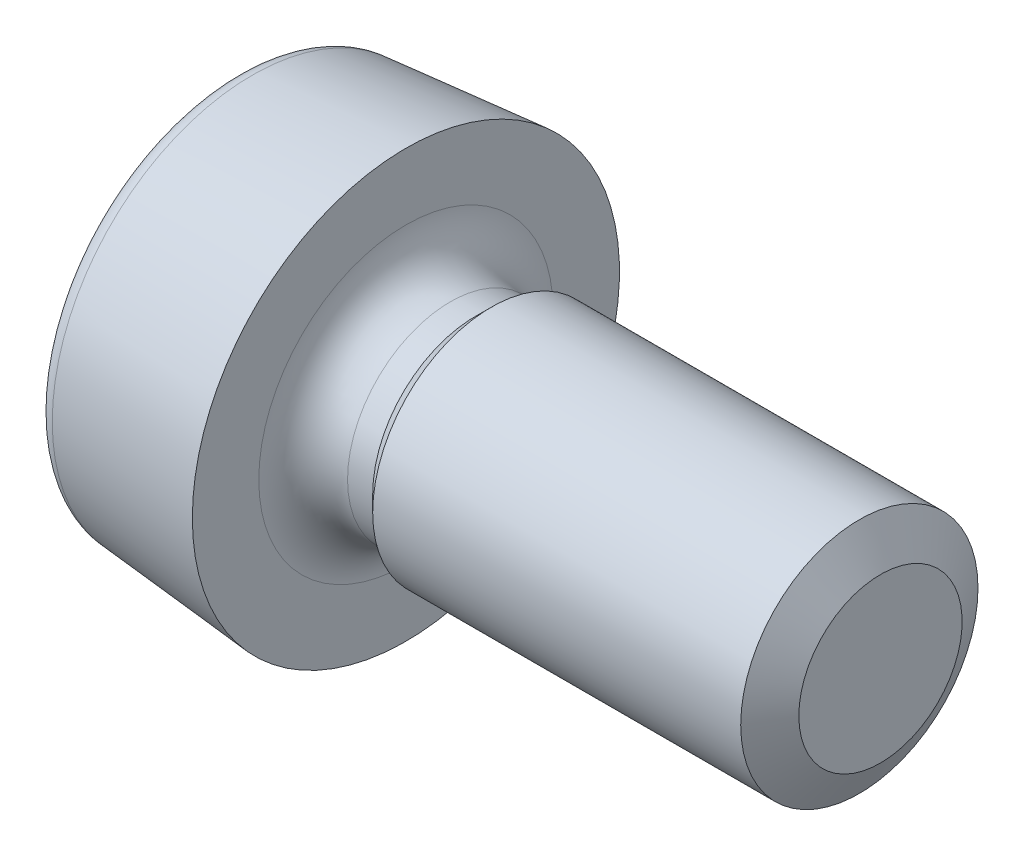
ISO-10303-21;
HEADER;
FILE_DESCRIPTION(('STEP AP214'),'2;1');
FILE_NAME('part.step','',(''),(''),'','','');
FILE_SCHEMA(('AUTOMOTIVE_DESIGN { 1 0 10303 214 1 1 1 1 }'));
ENDSEC;
DATA;
#1=APPLICATION_CONTEXT('core data for automotive mechanical design processes');
#2=APPLICATION_PROTOCOL_DEFINITION('international standard','automotive_design',2000,#1);
#3=PRODUCT_CONTEXT('',#1,'mechanical');
#4=PRODUCT('Part','Part','',(#3));
#5=PRODUCT_RELATED_PRODUCT_CATEGORY('part','',(#4));
#6=PRODUCT_DEFINITION_FORMATION('','',#4);
#7=PRODUCT_DEFINITION_CONTEXT('part definition',#1,'design');
#8=PRODUCT_DEFINITION('design','',#6,#7);
#9=PRODUCT_DEFINITION_SHAPE('','',#8);
#10=(LENGTH_UNIT() NAMED_UNIT(*) SI_UNIT(.MILLI.,.METRE.));
#11=(NAMED_UNIT(*) PLANE_ANGLE_UNIT() SI_UNIT($,.RADIAN.));
#12=(NAMED_UNIT(*) SI_UNIT($,.STERADIAN.) SOLID_ANGLE_UNIT());
#13=UNCERTAINTY_MEASURE_WITH_UNIT(LENGTH_MEASURE(1.E-05),#10,'distance_accuracy_value','');
#14=(GEOMETRIC_REPRESENTATION_CONTEXT(3) GLOBAL_UNCERTAINTY_ASSIGNED_CONTEXT((#13)) GLOBAL_UNIT_ASSIGNED_CONTEXT((#10,
#11,#12)) REPRESENTATION_CONTEXT('',''));
#15=CARTESIAN_POINT('',(0.,0.,0.));
#16=DIRECTION('',(0.,0.,1.));
#17=DIRECTION('',(1.,0.,0.));
#18=AXIS2_PLACEMENT_3D('',#15,#16,#17);
#19=CARTESIAN_POINT('',(0.,1.90925417084986,0.));
#20=DIRECTION('',(1.,0.,0.));
#21=DIRECTION('',(0.,0.,-1.));
#22=AXIS2_PLACEMENT_3D('',#19,#20,#21);
#23=PLANE('',#22);
#24=CARTESIAN_POINT('',(0.,0.,0.));
#25=DIRECTION('',(-1.,0.,0.));
#26=DIRECTION('',(0.,0.,1.));
#27=AXIS2_PLACEMENT_3D('',#24,#25,#26);
#28=CIRCLE('',#27,1.90925417084986);
#29=CARTESIAN_POINT('',(0.,0.,1.90925417084986));
#30=VERTEX_POINT('',#29);
#31=EDGE_CURVE('E171',#30,#30,#28,.T.);
#32=ORIENTED_EDGE('',*,*,#31,.T.);
#33=EDGE_LOOP('',(#32));
#34=FACE_BOUND('',#33,.T.);
#35=DIRECTION('',(0.,0.,1.));
#36=VECTOR('',#35,1.);
#37=CARTESIAN_POINT('',(0.,-0.225000000000005,1.35));
#38=LINE('',#37,#36);
#39=CARTESIAN_POINT('',(0.,-0.225000000000001,0.225));
#40=VERTEX_POINT('',#39);
#41=CARTESIAN_POINT('',(0.,-0.225000000000005,1.35));
#42=VERTEX_POINT('',#41);
#43=EDGE_CURVE('E137',#40,#42,#38,.T.);
#44=ORIENTED_EDGE('',*,*,#43,.F.);
#45=DIRECTION('',(0.,1.,0.));
#46=VECTOR('',#45,1.);
#47=CARTESIAN_POINT('',(0.,1.35,0.225));
#48=LINE('',#47,#46);
#49=CARTESIAN_POINT('',(0.,-1.35,0.225));
#50=VERTEX_POINT('',#49);
#51=EDGE_CURVE('E156',#50,#40,#48,.T.);
#52=ORIENTED_EDGE('',*,*,#51,.F.);
#53=DIRECTION('',(0.,0.,1.));
#54=VECTOR('',#53,1.);
#55=CARTESIAN_POINT('',(0.,-1.35,-0.225));
#56=LINE('',#55,#54);
#57=CARTESIAN_POINT('',(0.,-1.35,-0.225));
#58=VERTEX_POINT('',#57);
#59=EDGE_CURVE('E148',#58,#50,#56,.T.);
#60=ORIENTED_EDGE('',*,*,#59,.F.);
#61=DIRECTION('',(0.,-1.,0.));
#62=VECTOR('',#61,1.);
#63=CARTESIAN_POINT('',(0.,1.35,-0.225));
#64=LINE('',#63,#62);
#65=CARTESIAN_POINT('',(0.,-0.224999999999999,-0.225));
#66=VERTEX_POINT('',#65);
#67=EDGE_CURVE('E80',#66,#58,#64,.T.);
#68=ORIENTED_EDGE('',*,*,#67,.F.);
#69=CARTESIAN_POINT('',(0.,-0.224999999999995,-1.35));
#70=VERTEX_POINT('',#69);
#71=EDGE_CURVE('E95',#70,#66,#38,.T.);
#72=ORIENTED_EDGE('',*,*,#71,.F.);
#73=DIRECTION('',(0.,-1.,0.));
#74=VECTOR('',#73,1.);
#75=CARTESIAN_POINT('',(0.,0.225000000000005,-1.35));
#76=LINE('',#75,#74);
#77=CARTESIAN_POINT('',(0.,0.225000000000005,-1.35));
#78=VERTEX_POINT('',#77);
#79=EDGE_CURVE('E133',#78,#70,#76,.T.);
#80=ORIENTED_EDGE('',*,*,#79,.F.);
#81=DIRECTION('',(0.,0.,-1.));
#82=VECTOR('',#81,1.);
#83=CARTESIAN_POINT('',(0.,0.224999999999995,1.35));
#84=LINE('',#83,#82);
#85=CARTESIAN_POINT('',(0.,0.225000000000001,-0.225));
#86=VERTEX_POINT('',#85);
#87=EDGE_CURVE('E134',#86,#78,#84,.T.);
#88=ORIENTED_EDGE('',*,*,#87,.F.);
#89=CARTESIAN_POINT('',(0.,1.35,-0.225));
#90=VERTEX_POINT('',#89);
#91=EDGE_CURVE('E151',#90,#86,#64,.T.);
#92=ORIENTED_EDGE('',*,*,#91,.F.);
#93=DIRECTION('',(0.,0.,-1.));
#94=VECTOR('',#93,1.);
#95=CARTESIAN_POINT('',(0.,1.35,-0.225));
#96=LINE('',#95,#94);
#97=CARTESIAN_POINT('',(0.,1.35,0.225));
#98=VERTEX_POINT('',#97);
#99=EDGE_CURVE('E153',#98,#90,#96,.T.);
#100=ORIENTED_EDGE('',*,*,#99,.F.);
#101=CARTESIAN_POINT('',(0.,0.224999999999999,0.225));
#102=VERTEX_POINT('',#101);
#103=EDGE_CURVE('E65',#102,#98,#48,.T.);
#104=ORIENTED_EDGE('',*,*,#103,.F.);
#105=CARTESIAN_POINT('',(0.,0.224999999999995,1.35));
#106=VERTEX_POINT('',#105);
#107=EDGE_CURVE('E127',#106,#102,#84,.T.);
#108=ORIENTED_EDGE('',*,*,#107,.F.);
#109=DIRECTION('',(0.,1.,0.));
#110=VECTOR('',#109,1.);
#111=CARTESIAN_POINT('',(0.,0.224999999999995,1.35));
#112=LINE('',#111,#110);
#113=EDGE_CURVE('E115',#42,#106,#112,.T.);
#114=ORIENTED_EDGE('',*,*,#113,.F.);
#115=EDGE_LOOP('',(#44,#52,#60,#68,#72,#80,#88,#92,#100,#104,#108,#114));
#116=FACE_BOUND('',#115,.T.);
#117=ADVANCED_FACE('F42',(#34,#116),#23,.F.);
#118=CARTESIAN_POINT('',(1.2,0.,0.));
#119=DIRECTION('',(-0.184288535050185,0.,-0.982872186934322));
#120=DIRECTION('',(-0.982872186934322,0.,0.184288535050185));
#121=AXIS2_PLACEMENT_3D('',#118,#119,#120);
#122=PLANE('',#121);
#123=ORIENTED_EDGE('',*,*,#51,.T.);
#124=DIRECTION('',(0.966595349328283,0.181236627999054,-0.181236627999053));
#125=VECTOR('',#124,1.);
#126=CARTESIAN_POINT('',(1.2,0.,0.));
#127=LINE('',#126,#125);
#128=CARTESIAN_POINT('',(1.2,0.,0.));
#129=VERTEX_POINT('',#128);
#130=EDGE_CURVE('E87',#40,#129,#127,.T.);
#131=ORIENTED_EDGE('',*,*,#130,.T.);
#132=DIRECTION('',(0.659268514744263,0.741677079087296,-0.123612846514549));
#133=VECTOR('',#132,1.);
#134=CARTESIAN_POINT('',(0.,-1.35,0.225));
#135=LINE('',#134,#133);
#136=EDGE_CURVE('E161',#50,#129,#135,.T.);
#137=ORIENTED_EDGE('',*,*,#136,.F.);
#138=EDGE_LOOP('',(#123,#131,#137));
#139=FACE_BOUND('',#138,.T.);
#140=ADVANCED_FACE('F205',(#139),#122,.T.);
#141=DIRECTION('',(0.659268514744263,-0.741677079087296,-0.123612846514549));
#142=VECTOR('',#141,1.);
#143=CARTESIAN_POINT('',(0.,1.35,0.225));
#144=LINE('',#143,#142);
#145=EDGE_CURVE('E159',#98,#129,#144,.T.);
#146=ORIENTED_EDGE('',*,*,#145,.T.);
#147=DIRECTION('',(-0.966595349328283,0.181236627999053,0.181236627999053));
#148=VECTOR('',#147,1.);
#149=CARTESIAN_POINT('',(1.2,0.,0.));
#150=LINE('',#149,#148);
#151=EDGE_CURVE('E123',#129,#102,#150,.T.);
#152=ORIENTED_EDGE('',*,*,#151,.T.);
#153=ORIENTED_EDGE('',*,*,#103,.T.);
#154=EDGE_LOOP('',(#146,#152,#153));
#155=FACE_BOUND('',#154,.T.);
#156=ADVANCED_FACE('F198',(#155),#122,.T.);
#157=CARTESIAN_POINT('',(1.2,0.,0.));
#158=DIRECTION('',(-0.184288535050185,0.,0.982872186934322));
#159=DIRECTION('',(0.982872186934322,0.,0.184288535050185));
#160=AXIS2_PLACEMENT_3D('',#157,#158,#159);
#161=PLANE('',#160);
#162=DIRECTION('',(0.659268514744263,0.741677079087296,0.123612846514549));
#163=VECTOR('',#162,1.);
#164=CARTESIAN_POINT('',(0.,-1.35,-0.225));
#165=LINE('',#164,#163);
#166=EDGE_CURVE('E147',#58,#129,#165,.T.);
#167=ORIENTED_EDGE('',*,*,#166,.T.);
#168=DIRECTION('',(-0.966595349328283,-0.181236627999053,-0.181236627999053));
#169=VECTOR('',#168,1.);
#170=CARTESIAN_POINT('',(1.2,0.,0.));
#171=LINE('',#170,#169);
#172=EDGE_CURVE('E11',#129,#66,#171,.T.);
#173=ORIENTED_EDGE('',*,*,#172,.T.);
#174=ORIENTED_EDGE('',*,*,#67,.T.);
#175=EDGE_LOOP('',(#167,#173,#174));
#176=FACE_BOUND('',#175,.T.);
#177=ADVANCED_FACE('F199',(#176),#161,.T.);
#178=ORIENTED_EDGE('',*,*,#91,.T.);
#179=DIRECTION('',(0.966595349328283,-0.181236627999054,0.181236627999053));
#180=VECTOR('',#179,1.);
#181=CARTESIAN_POINT('',(1.2,0.,0.));
#182=LINE('',#181,#180);
#183=EDGE_CURVE('E49',#86,#129,#182,.T.);
#184=ORIENTED_EDGE('',*,*,#183,.T.);
#185=DIRECTION('',(0.659268514744263,-0.741677079087296,0.123612846514549));
#186=VECTOR('',#185,1.);
#187=CARTESIAN_POINT('',(0.,1.35,-0.225));
#188=LINE('',#187,#186);
#189=EDGE_CURVE('E56',#90,#129,#188,.T.);
#190=ORIENTED_EDGE('',*,*,#189,.F.);
#191=EDGE_LOOP('',(#178,#184,#190));
#192=FACE_BOUND('',#191,.T.);
#193=ADVANCED_FACE('F192',(#192),#161,.T.);
#194=CARTESIAN_POINT('',(-2.16958058991907,0.,0.));
#195=DIRECTION('',(-1.,0.,0.));
#196=DIRECTION('',(0.,0.,1.));
#197=AXIS2_PLACEMENT_3D('',#194,#195,#196);
#198=CYLINDRICAL_SURFACE('',#197,1.25);
#199=CARTESIAN_POINT('',(2.7,0.,0.));
#200=DIRECTION('',(-1.,0.,0.));
#201=DIRECTION('',(0.,0.,1.));
#202=AXIS2_PLACEMENT_3D('',#199,#200,#201);
#203=CIRCLE('',#202,1.25);
#204=CARTESIAN_POINT('',(2.7,0.,1.25));
#205=VERTEX_POINT('',#204);
#206=EDGE_CURVE('E190',#205,#205,#203,.T.);
#207=ORIENTED_EDGE('',*,*,#206,.F.);
#208=EDGE_LOOP('',(#207));
#209=FACE_BOUND('',#208,.T.);
#210=CARTESIAN_POINT('',(6.57743720258487,0.,0.));
#211=DIRECTION('',(-1.,0.,0.));
#212=DIRECTION('',(0.,0.,1.));
#213=AXIS2_PLACEMENT_3D('',#210,#211,#212);
#214=CIRCLE('',#213,1.25);
#215=CARTESIAN_POINT('',(6.57743720258487,0.,1.25));
#216=VERTEX_POINT('',#215);
#217=EDGE_CURVE('E168',#216,#216,#214,.T.);
#218=ORIENTED_EDGE('',*,*,#217,.T.);
#219=EDGE_LOOP('',(#218));
#220=FACE_BOUND('',#219,.T.);
#221=ADVANCED_FACE('F263',(#209,#220),#198,.T.);
#222=CARTESIAN_POINT('',(2.7,0.,0.));
#223=DIRECTION('',(1.,0.,0.));
#224=DIRECTION('',(0.,0.,-1.));
#225=AXIS2_PLACEMENT_3D('',#222,#223,#224);
#226=CONICAL_SURFACE('',#225,1.25,0.785398163397442);
#227=CARTESIAN_POINT('',(2.5325,0.,0.));
#228=DIRECTION('',(-1.,0.,0.));
#229=DIRECTION('',(0.,0.,1.));
#230=AXIS2_PLACEMENT_3D('',#227,#228,#229);
#231=CIRCLE('',#230,1.0825);
#232=CARTESIAN_POINT('',(2.5325,0.,1.0825));
#233=VERTEX_POINT('',#232);
#234=EDGE_CURVE('E187',#233,#233,#231,.T.);
#235=ORIENTED_EDGE('',*,*,#234,.F.);
#236=EDGE_LOOP('',(#235));
#237=FACE_BOUND('',#236,.T.);
#238=ORIENTED_EDGE('',*,*,#206,.T.);
#239=EDGE_LOOP('',(#238));
#240=FACE_BOUND('',#239,.T.);
#241=ADVANCED_FACE('F257',(#237,#240),#226,.T.);
#242=CARTESIAN_POINT('',(-2.16958058991907,0.,0.));
#243=DIRECTION('',(-1.,0.,0.));
#244=DIRECTION('',(0.,0.,1.));
#245=AXIS2_PLACEMENT_3D('',#242,#243,#244);
#246=CYLINDRICAL_SURFACE('',#245,1.0825);
#247=CARTESIAN_POINT('',(2.2675,0.,0.));
#248=DIRECTION('',(-1.,0.,0.));
#249=DIRECTION('',(0.,0.,1.));
#250=AXIS2_PLACEMENT_3D('',#247,#248,#249);
#251=CIRCLE('',#250,1.0825);
#252=CARTESIAN_POINT('',(2.2675,0.,1.0825));
#253=VERTEX_POINT('',#252);
#254=EDGE_CURVE('E184',#253,#253,#251,.T.);
#255=ORIENTED_EDGE('',*,*,#254,.F.);
#256=EDGE_LOOP('',(#255));
#257=FACE_BOUND('',#256,.T.);
#258=ORIENTED_EDGE('',*,*,#234,.T.);
#259=EDGE_LOOP('',(#258));
#260=FACE_BOUND('',#259,.T.);
#261=ADVANCED_FACE('F251',(#257,#260),#246,.T.);
#262=CARTESIAN_POINT('',(2.2675,0.,0.));
#263=DIRECTION('',(-1.,0.,0.));
#264=DIRECTION('',(0.,0.,1.));
#265=AXIS2_PLACEMENT_3D('',#262,#263,#264);
#266=TOROIDAL_SURFACE('',#265,1.55,0.4675);
#267=CARTESIAN_POINT('',(1.8,0.,0.));
#268=DIRECTION('',(-1.,0.,0.));
#269=DIRECTION('',(0.,0.,1.));
#270=AXIS2_PLACEMENT_3D('',#267,#268,#269);
#271=CIRCLE('',#270,1.55);
#272=CARTESIAN_POINT('',(1.8,0.,1.55));
#273=VERTEX_POINT('',#272);
#274=EDGE_CURVE('E181',#273,#273,#271,.T.);
#275=ORIENTED_EDGE('',*,*,#274,.F.);
#276=EDGE_LOOP('',(#275));
#277=FACE_BOUND('',#276,.T.);
#278=ORIENTED_EDGE('',*,*,#254,.T.);
#279=EDGE_LOOP('',(#278));
#280=FACE_BOUND('',#279,.T.);
#281=ADVANCED_FACE('F245',(#277,#280),#266,.F.);
#282=CARTESIAN_POINT('',(1.8,1.55,0.));
#283=DIRECTION('',(-1.,0.,0.));
#284=DIRECTION('',(0.,0.,1.));
#285=AXIS2_PLACEMENT_3D('',#282,#283,#284);
#286=PLANE('',#285);
#287=CARTESIAN_POINT('',(1.8,0.,0.));
#288=DIRECTION('',(-1.,0.,0.));
#289=DIRECTION('',(0.,0.,1.));
#290=AXIS2_PLACEMENT_3D('',#287,#288,#289);
#291=CIRCLE('',#290,2.25);
#292=CARTESIAN_POINT('',(1.8,0.,2.25));
#293=VERTEX_POINT('',#292);
#294=EDGE_CURVE('E177',#293,#293,#291,.T.);
#295=ORIENTED_EDGE('',*,*,#294,.F.);
#296=EDGE_LOOP('',(#295));
#297=FACE_BOUND('',#296,.T.);
#298=ORIENTED_EDGE('',*,*,#274,.T.);
#299=EDGE_LOOP('',(#298));
#300=FACE_BOUND('',#299,.T.);
#301=ADVANCED_FACE('F239',(#297,#300),#286,.F.);
#302=CARTESIAN_POINT('',(1.8,0.,0.));
#303=DIRECTION('',(1.,0.,0.));
#304=DIRECTION('',(0.,0.,-1.));
#305=AXIS2_PLACEMENT_3D('',#302,#303,#304);
#306=CONICAL_SURFACE('',#305,2.25,0.0872664625997097);
#307=CARTESIAN_POINT('',(0.18256885145047,0.,0.));
#308=DIRECTION('',(-1.,0.,0.));
#309=DIRECTION('',(0.,0.,1.));
#310=AXIS2_PLACEMENT_3D('',#307,#308,#309);
#311=CIRCLE('',#310,2.10849311046821);
#312=CARTESIAN_POINT('',(0.18256885145047,0.,2.10849311046821));
#313=VERTEX_POINT('',#312);
#314=EDGE_CURVE('E174',#313,#313,#311,.T.);
#315=ORIENTED_EDGE('',*,*,#314,.F.);
#316=EDGE_LOOP('',(#315));
#317=FACE_BOUND('',#316,.T.);
#318=ORIENTED_EDGE('',*,*,#294,.T.);
#319=EDGE_LOOP('',(#318));
#320=FACE_BOUND('',#319,.T.);
#321=ADVANCED_FACE('F233',(#317,#320),#306,.T.);
#322=CARTESIAN_POINT('',(0.2,0.,0.));
#323=DIRECTION('',(-1.,0.,0.));
#324=DIRECTION('',(0.,0.,1.));
#325=AXIS2_PLACEMENT_3D('',#322,#323,#324);
#326=TOROIDAL_SURFACE('',#325,1.90925417084986,0.2);
#327=ORIENTED_EDGE('',*,*,#31,.F.);
#328=EDGE_LOOP('',(#327));
#329=FACE_BOUND('',#328,.T.);
#330=ORIENTED_EDGE('',*,*,#314,.T.);
#331=EDGE_LOOP('',(#330));
#332=FACE_BOUND('',#331,.T.);
#333=ADVANCED_FACE('F229',(#329,#332),#326,.T.);
#334=CARTESIAN_POINT('',(6.57743720258487,0.,0.));
#335=DIRECTION('',(-1.,0.,0.));
#336=DIRECTION('',(0.,0.,1.));
#337=AXIS2_PLACEMENT_3D('',#334,#335,#336);
#338=CONICAL_SURFACE('',#337,1.25,1.05188801855281);
#339=CARTESIAN_POINT('',(6.8,0.,0.));
#340=DIRECTION('',(-1.,0.,0.));
#341=DIRECTION('',(0.,0.,1.));
#342=AXIS2_PLACEMENT_3D('',#339,#340,#341);
#343=CIRCLE('',#342,0.860299999999999);
#344=CARTESIAN_POINT('',(6.8,0.,0.860299999999999));
#345=VERTEX_POINT('',#344);
#346=EDGE_CURVE('E155',#345,#345,#343,.T.);
#347=ORIENTED_EDGE('',*,*,#346,.T.);
#348=EDGE_LOOP('',(#347));
#349=FACE_BOUND('',#348,.T.);
#350=ORIENTED_EDGE('',*,*,#217,.F.);
#351=EDGE_LOOP('',(#350));
#352=FACE_BOUND('',#351,.T.);
#353=ADVANCED_FACE('F232',(#349,#352),#338,.T.);
#354=CARTESIAN_POINT('',(6.8,0.,0.));
#355=DIRECTION('',(-1.,0.,0.));
#356=DIRECTION('',(0.,0.,1.));
#357=AXIS2_PLACEMENT_3D('',#354,#355,#356);
#358=PLANE('',#357);
#359=ORIENTED_EDGE('',*,*,#346,.F.);
#360=EDGE_LOOP('',(#359));
#361=FACE_BOUND('',#360,.T.);
#362=ADVANCED_FACE('F273',(#361),#358,.F.);
#363=CARTESIAN_POINT('',(0.,1.35,0.225));
#364=DIRECTION('',(0.74740931868366,0.66436383882992,0.));
#365=DIRECTION('',(-0.66436383882992,0.74740931868366,0.));
#366=AXIS2_PLACEMENT_3D('',#363,#364,#365);
#367=PLANE('',#366);
#368=ORIENTED_EDGE('',*,*,#145,.F.);
#369=ORIENTED_EDGE('',*,*,#99,.T.);
#370=ORIENTED_EDGE('',*,*,#189,.T.);
#371=EDGE_LOOP('',(#368,#369,#370));
#372=FACE_BOUND('',#371,.T.);
#373=ADVANCED_FACE('F197',(#372),#367,.F.);
#374=CARTESIAN_POINT('',(0.,-1.35,-0.225));
#375=DIRECTION('',(0.74740931868366,-0.66436383882992,0.));
#376=DIRECTION('',(0.66436383882992,0.74740931868366,0.));
#377=AXIS2_PLACEMENT_3D('',#374,#375,#376);
#378=PLANE('',#377);
#379=ORIENTED_EDGE('',*,*,#166,.F.);
#380=ORIENTED_EDGE('',*,*,#59,.T.);
#381=ORIENTED_EDGE('',*,*,#136,.T.);
#382=EDGE_LOOP('',(#379,#380,#381));
#383=FACE_BOUND('',#382,.T.);
#384=ADVANCED_FACE('F202',(#383),#378,.F.);
#385=CARTESIAN_POINT('',(1.2,0.,0.));
#386=DIRECTION('',(-0.184288535050185,0.982872186934322,0.));
#387=DIRECTION('',(-0.982872186934322,-0.184288535050185,0.));
#388=AXIS2_PLACEMENT_3D('',#385,#386,#387);
#389=PLANE('',#388);
#390=DIRECTION('',(0.659268514744263,0.123612846514547,0.741677079087297));
#391=VECTOR('',#390,1.);
#392=CARTESIAN_POINT('',(0.,-0.224999999999995,-1.35));
#393=LINE('',#392,#391);
#394=EDGE_CURVE('E129',#70,#129,#393,.T.);
#395=ORIENTED_EDGE('',*,*,#394,.F.);
#396=ORIENTED_EDGE('',*,*,#71,.T.);
#397=ORIENTED_EDGE('',*,*,#172,.F.);
#398=EDGE_LOOP('',(#395,#396,#397));
#399=FACE_BOUND('',#398,.T.);
#400=ADVANCED_FACE('F210',(#399),#389,.T.);
#401=CARTESIAN_POINT('',(1.2,0.,0.));
#402=DIRECTION('',(-0.184288535050185,-0.982872186934322,0.));
#403=DIRECTION('',(0.982872186934322,-0.184288535050185,0.));
#404=AXIS2_PLACEMENT_3D('',#401,#402,#403);
#405=PLANE('',#404);
#406=ORIENTED_EDGE('',*,*,#87,.T.);
#407=DIRECTION('',(0.659268514744263,-0.123612846514552,0.741677079087296));
#408=VECTOR('',#407,1.);
#409=CARTESIAN_POINT('',(0.,0.225000000000005,-1.35));
#410=LINE('',#409,#408);
#411=EDGE_CURVE('E130',#78,#129,#410,.T.);
#412=ORIENTED_EDGE('',*,*,#411,.T.);
#413=ORIENTED_EDGE('',*,*,#183,.F.);
#414=EDGE_LOOP('',(#406,#412,#413));
#415=FACE_BOUND('',#414,.T.);
#416=ADVANCED_FACE('F216',(#415),#405,.T.);
#417=CARTESIAN_POINT('',(0.,0.225000000000005,-1.35));
#418=DIRECTION('',(0.74740931868366,0.,-0.66436383882992));
#419=DIRECTION('',(0.66436383882992,0.,0.74740931868366));
#420=AXIS2_PLACEMENT_3D('',#417,#418,#419);
#421=PLANE('',#420);
#422=ORIENTED_EDGE('',*,*,#411,.F.);
#423=ORIENTED_EDGE('',*,*,#79,.T.);
#424=ORIENTED_EDGE('',*,*,#394,.T.);
#425=EDGE_LOOP('',(#422,#423,#424));
#426=FACE_BOUND('',#425,.T.);
#427=ADVANCED_FACE('F208',(#426),#421,.F.);
#428=ORIENTED_EDGE('',*,*,#43,.T.);
#429=DIRECTION('',(0.659268514744263,0.123612846514552,-0.741677079087296));
#430=VECTOR('',#429,1.);
#431=CARTESIAN_POINT('',(0.,-0.225000000000005,1.35));
#432=LINE('',#431,#430);
#433=EDGE_CURVE('E120',#42,#129,#432,.T.);
#434=ORIENTED_EDGE('',*,*,#433,.T.);
#435=ORIENTED_EDGE('',*,*,#130,.F.);
#436=EDGE_LOOP('',(#428,#434,#435));
#437=FACE_BOUND('',#436,.T.);
#438=ADVANCED_FACE('F206',(#437),#389,.T.);
#439=DIRECTION('',(0.659268514744263,-0.123612846514547,-0.741677079087297));
#440=VECTOR('',#439,1.);
#441=CARTESIAN_POINT('',(0.,0.224999999999995,1.35));
#442=LINE('',#441,#440);
#443=EDGE_CURVE('E118',#106,#129,#442,.T.);
#444=ORIENTED_EDGE('',*,*,#443,.F.);
#445=ORIENTED_EDGE('',*,*,#107,.T.);
#446=ORIENTED_EDGE('',*,*,#151,.F.);
#447=EDGE_LOOP('',(#444,#445,#446));
#448=FACE_BOUND('',#447,.T.);
#449=ADVANCED_FACE('F126',(#448),#405,.T.);
#450=CARTESIAN_POINT('',(0.,-0.225000000000005,1.35));
#451=DIRECTION('',(0.74740931868366,0.,0.66436383882992));
#452=DIRECTION('',(-0.66436383882992,0.,0.74740931868366));
#453=AXIS2_PLACEMENT_3D('',#450,#451,#452);
#454=PLANE('',#453);
#455=ORIENTED_EDGE('',*,*,#433,.F.);
#456=ORIENTED_EDGE('',*,*,#113,.T.);
#457=ORIENTED_EDGE('',*,*,#443,.T.);
#458=EDGE_LOOP('',(#455,#456,#457));
#459=FACE_BOUND('',#458,.T.);
#460=ADVANCED_FACE('F117',(#459),#454,.F.);
#461=CLOSED_SHELL('',(#117,#140,#156,#177,#193,#221,#241,#261,#281,#301,#321,#333,#353,#362,
#373,#384,#400,#416,#427,#438,#449,#460));
#462=MANIFOLD_SOLID_BREP('B2',#461);
#463=ADVANCED_BREP_SHAPE_REPRESENTATION('',(#18,#462),#14);
#464=SHAPE_DEFINITION_REPRESENTATION(#9,#463);
ENDSEC;
END-ISO-10303-21;
